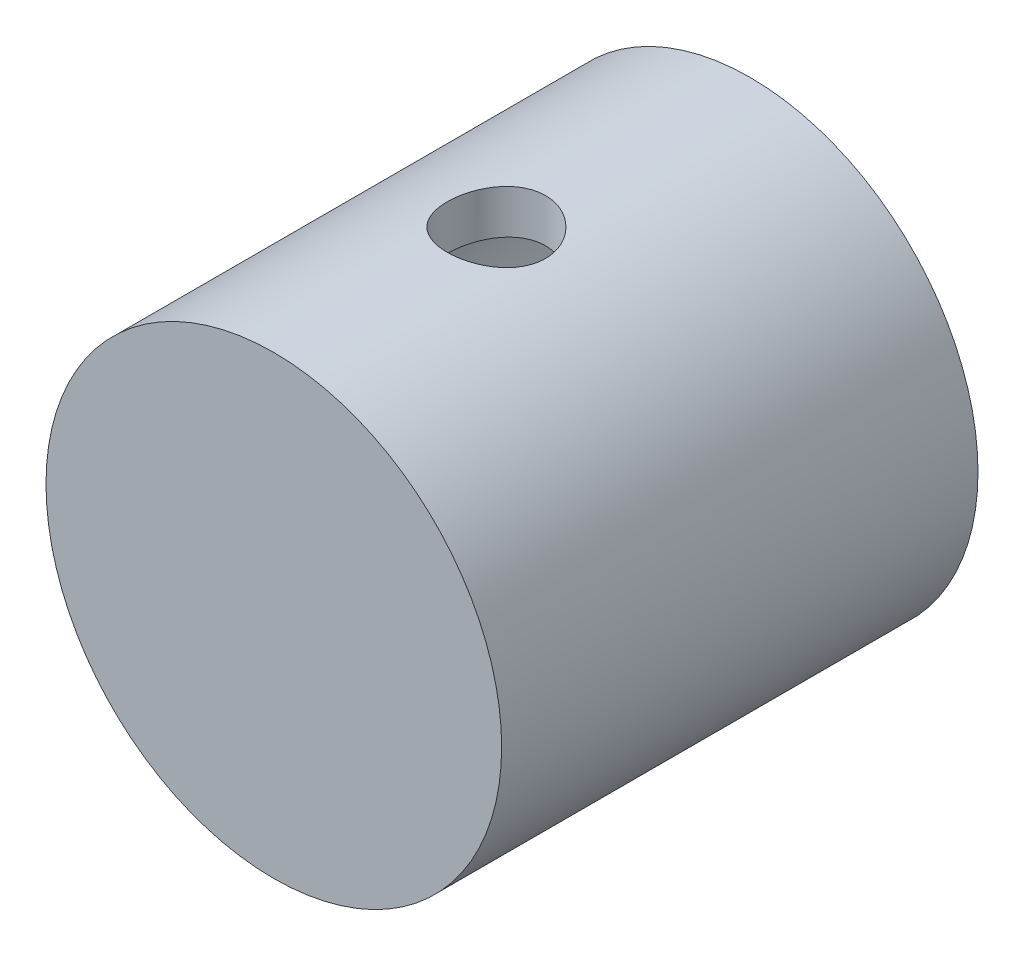
ISO-10303-21;
HEADER;
FILE_DESCRIPTION(('STEP AP214'),'2;1');
FILE_NAME('part.step','',(''),(''),'','','');
FILE_SCHEMA(('AUTOMOTIVE_DESIGN { 1 0 10303 214 1 1 1 1 }'));
ENDSEC;
DATA;
#1=APPLICATION_CONTEXT('core data for automotive mechanical design processes');
#2=APPLICATION_PROTOCOL_DEFINITION('international standard','automotive_design',2000,#1);
#3=PRODUCT_CONTEXT('',#1,'mechanical');
#4=PRODUCT('Part','Part','',(#3));
#5=PRODUCT_RELATED_PRODUCT_CATEGORY('part','',(#4));
#6=PRODUCT_DEFINITION_FORMATION('','',#4);
#7=PRODUCT_DEFINITION_CONTEXT('part definition',#1,'design');
#8=PRODUCT_DEFINITION('design','',#6,#7);
#9=PRODUCT_DEFINITION_SHAPE('','',#8);
#10=(LENGTH_UNIT() NAMED_UNIT(*) SI_UNIT(.MILLI.,.METRE.));
#11=(NAMED_UNIT(*) PLANE_ANGLE_UNIT() SI_UNIT($,.RADIAN.));
#12=(NAMED_UNIT(*) SI_UNIT($,.STERADIAN.) SOLID_ANGLE_UNIT());
#13=UNCERTAINTY_MEASURE_WITH_UNIT(LENGTH_MEASURE(1.E-05),#10,'distance_accuracy_value','');
#14=(GEOMETRIC_REPRESENTATION_CONTEXT(3) GLOBAL_UNCERTAINTY_ASSIGNED_CONTEXT((#13)) GLOBAL_UNIT_ASSIGNED_CONTEXT((#10,
#11,#12)) REPRESENTATION_CONTEXT('',''));
#15=CARTESIAN_POINT('',(0.,0.,0.));
#16=DIRECTION('',(0.,0.,1.));
#17=DIRECTION('',(1.,0.,0.));
#18=AXIS2_PLACEMENT_3D('',#15,#16,#17);
#19=CARTESIAN_POINT('',(0.,0.,46.));
#20=DIRECTION('',(0.,0.,-1.));
#21=DIRECTION('',(-1.,0.,0.));
#22=AXIS2_PLACEMENT_3D('',#19,#20,#21);
#23=CYLINDRICAL_SURFACE('',#22,22.);
#24=CARTESIAN_POINT('',(0.,-22.,29.2550355978762));
#25=CARTESIAN_POINT('',(0.26353204296739,-21.9999951294219,29.2550264823695));
#26=CARTESIAN_POINT('',(0.527175007044603,-21.995216638677,29.2330302389447));
#27=CARTESIAN_POINT('',(1.04697793452304,-21.9766157400084,29.1457144294558));
#28=CARTESIAN_POINT('',(1.30313231615062,-21.9627867570527,29.0803633663637));
#29=CARTESIAN_POINT('',(1.80037020267959,-21.927625318056,28.9084756851456));
#30=CARTESIAN_POINT('',(2.04146895126697,-21.9063006013467,28.801981535985));
#31=CARTESIAN_POINT('',(2.50236705126893,-21.8584518186079,28.5509641272918));
#32=CARTESIAN_POINT('',(2.72216706409193,-21.8319279141108,28.4064420491923));
#33=CARTESIAN_POINT('',(3.1376798099678,-21.7761241503772,28.0810757706023));
#34=CARTESIAN_POINT('',(3.33301125321571,-21.7468108407901,27.8997503336598));
#35=CARTESIAN_POINT('',(3.69073669867752,-21.6889689352535,27.5069578464537));
#36=CARTESIAN_POINT('',(3.85312782346228,-21.660440408045,27.2954881657509));
#37=CARTESIAN_POINT('',(4.14203598377663,-21.6070688778162,26.8456027662467));
#38=CARTESIAN_POINT('',(4.26814883514838,-21.5822687660423,26.6069219456019));
#39=CARTESIAN_POINT('',(4.47832844445401,-21.539641387516,26.111131882592));
#40=CARTESIAN_POINT('',(4.56240009176495,-21.5218133099712,25.8540247871743));
#41=CARTESIAN_POINT('',(4.68485414272049,-21.4954888932389,25.3328114244865));
#42=CARTESIAN_POINT('',(4.72391069221368,-21.486855015404,25.0688706353359));
#43=CARTESIAN_POINT('',(4.75732170448075,-21.479483346558,24.5380525051373));
#44=CARTESIAN_POINT('',(4.75168151640916,-21.4807443713582,24.2711755193006));
#45=CARTESIAN_POINT('',(4.69640206671622,-21.4928954361561,23.7470599127777));
#46=CARTESIAN_POINT('',(4.64754432524886,-21.5036144353184,23.4897342988595));
#47=CARTESIAN_POINT('',(4.50845411405232,-21.5332034385052,22.9870203788083));
#48=CARTESIAN_POINT('',(4.41821937643281,-21.5520738893108,22.7416327278155));
#49=CARTESIAN_POINT('',(4.19821456451248,-21.5960091025994,22.267554770304));
#50=CARTESIAN_POINT('',(4.06814254711242,-21.6211208867659,22.0390091251793));
#51=CARTESIAN_POINT('',(3.77236786380136,-21.6746802550419,21.6066985014783));
#52=CARTESIAN_POINT('',(3.60666045888965,-21.7031282825955,21.4029368244658));
#53=CARTESIAN_POINT('',(3.24017447299117,-21.7608897445783,21.0214771269695));
#54=CARTESIAN_POINT('',(3.03873094855511,-21.7902087890038,20.8444181824244));
#55=CARTESIAN_POINT('',(2.6086800808275,-21.8458628568335,20.5264941155677));
#56=CARTESIAN_POINT('',(2.38007226971292,-21.8721978288307,20.3856296167287));
#57=CARTESIAN_POINT('',(1.90141306408901,-21.9189985841214,20.1439413828342));
#58=CARTESIAN_POINT('',(1.65131897504386,-21.9394523135195,20.0431997211332));
#59=CARTESIAN_POINT('',(1.13721322725776,-21.9720961468981,19.8853469239985));
#60=CARTESIAN_POINT('',(0.87320354508278,-21.9842874210839,19.8282296099352));
#61=CARTESIAN_POINT('',(0.344244231815079,-21.9988667139343,19.760172526289));
#62=CARTESIAN_POINT('',(0.0794119141996826,-22.0014400901811,19.7483595269488));
#63=CARTESIAN_POINT('',(-0.448441985428533,-21.9970123463287,19.7688819111574));
#64=CARTESIAN_POINT('',(-0.711463685799219,-21.9900118581506,19.8012143808915));
#65=CARTESIAN_POINT('',(-1.22534871353153,-21.9673397922822,19.9083855746546));
#66=CARTESIAN_POINT('',(-1.47631171082119,-21.9517613770129,19.9827678355097));
#67=CARTESIAN_POINT('',(-1.96219970824823,-21.9136764897364,20.1714217427214));
#68=CARTESIAN_POINT('',(-2.19712336440687,-21.8911694380289,20.2856967269021));
#69=CARTESIAN_POINT('',(-2.64788611177591,-21.8412658325223,20.5527224667595));
#70=CARTESIAN_POINT('',(-2.86341290680292,-21.813805391972,20.7059882025687));
#71=CARTESIAN_POINT('',(-3.26600155810255,-21.75717438073,21.0459648953836));
#72=CARTESIAN_POINT('',(-3.45305981315513,-21.7280035943281,21.2326800771919));
#73=CARTESIAN_POINT('',(-3.79684116584989,-21.6706017739989,21.6382578217244));
#74=CARTESIAN_POINT('',(-3.95296036730982,-21.6423969597818,21.8576366580874));
#75=CARTESIAN_POINT('',(-4.2261415389516,-21.5907187278185,22.3200136114647));
#76=CARTESIAN_POINT('',(-4.34320518360488,-21.5672451072439,22.5630107152903));
#77=CARTESIAN_POINT('',(-4.53417217746252,-21.527907413176,23.064432268702));
#78=CARTESIAN_POINT('',(-4.60831576785363,-21.5120010735777,23.3227617435038));
#79=CARTESIAN_POINT('',(-4.71204604721923,-21.4895204764784,23.8485991315223));
#80=CARTESIAN_POINT('',(-4.74163965207832,-21.4829447705107,24.1161056135158));
#81=CARTESIAN_POINT('',(-4.75514145715969,-21.479959567652,24.6466187500412));
#82=CARTESIAN_POINT('',(-4.74000662243135,-21.48333711641,24.9096003051889));
#83=CARTESIAN_POINT('',(-4.66661628485676,-21.4993971553955,25.4291715641842));
#84=CARTESIAN_POINT('',(-4.60836126344546,-21.512079541735,25.6857613393627));
#85=CARTESIAN_POINT('',(-4.45084114787554,-21.545217774067,26.1845287850948));
#86=CARTESIAN_POINT('',(-4.35171192063186,-21.5656478486499,26.4267511903822));
#87=CARTESIAN_POINT('',(-4.1153753122238,-21.6119902740465,26.8912700741197));
#88=CARTESIAN_POINT('',(-3.97816408161354,-21.6379031790185,27.1135645351852));
#89=CARTESIAN_POINT('',(-3.66636960914247,-21.6929300863033,27.5366423778243));
#90=CARTESIAN_POINT('',(-3.49110292901713,-21.7220971250603,27.7369152852614));
#91=CARTESIAN_POINT('',(-3.10956192321569,-21.7799858535104,28.1055217900181));
#92=CARTESIAN_POINT('',(-2.90328044860301,-21.808707438838,28.2738480033074));
#93=CARTESIAN_POINT('',(-2.46244181668199,-21.8628969619462,28.5758045498498));
#94=CARTESIAN_POINT('',(-2.22756183078001,-21.8883194637862,28.7089721650104));
#95=CARTESIAN_POINT('',(-1.73825627645902,-21.9325920643142,28.9337282310939));
#96=CARTESIAN_POINT('',(-1.4838475079755,-21.9514477365752,29.025351962281));
#97=CARTESIAN_POINT('',(-1.02427764777811,-21.9770509267838,29.1478679139807));
#98=CARTESIAN_POINT('',(-0.821624223165775,-21.9856039881691,29.1879799139001));
#99=CARTESIAN_POINT('',(-0.412669769475188,-21.997080313052,29.2415667630072));
#100=CARTESIAN_POINT('',(-0.206368894674726,-22.0000038140933,29.255042736124));
#101=CARTESIAN_POINT('',(0.,-22.,29.2550355978762));
#102=B_SPLINE_CURVE_WITH_KNOTS('',3,(#24,#25,#26,#27,#28,#29,#30,#31,#32,#33,#34,#35,#36,#37,
#38,#39,#40,#41,#42,#43,#44,#45,#46,#47,#48,#49,#50,#51,#52,#53,#54,#55,#56,#57,#58,#59,#60,#61,
#62,#63,#64,#65,#66,#67,#68,#69,#70,#71,#72,#73,#74,#75,#76,#77,#78,#79,#80,#81,#82,#83,#84,#85,
#86,#87,#88,#89,#90,#91,#92,#93,#94,#95,#96,#97,#98,#99,#100,#101),.UNSPECIFIED.,.T.,.F.,(4,2,2,
2,2,2,2,2,2,2,2,2,2,2,2,2,2,2,2,2,2,2,2,2,2,2,2,2,2,2,2,2,2,2,2,2,2,2,4),(0.,0.78984080440211,
1.58025605292088,2.36985758476699,3.1594345885568,3.96009143600953,4.7608181929918,
5.57014811205846,6.37938388444031,7.17633628395209,7.97319330833398,8.755928483683,
9.53870656620086,10.3275709659652,11.1165403384432,11.9221209018524,12.727715340972,
13.5349493045839,14.3420689163397,15.1335509319106,15.9249807083636,16.7079798460244,
17.4910445129321,18.2850436133355,19.0791430698892,19.8874775227463,20.695777314545,
21.4995078461554,22.303113594762,23.0896515197956,23.8761806633008,24.6601161744422,
25.444130957072,26.2436021126139,27.0432578302562,27.8529651075726,28.6619834642787,
29.2805247628391,29.8990399609838),.UNSPECIFIED.);
#103=CARTESIAN_POINT('',(0.,-22.,29.2550355978762));
#104=VERTEX_POINT('',#103);
#105=EDGE_CURVE('E95',#104,#104,#102,.T.);
#106=ORIENTED_EDGE('',*,*,#105,.T.);
#107=EDGE_LOOP('',(#106));
#108=FACE_BOUND('',#107,.T.);
#109=CARTESIAN_POINT('',(0.,22.,29.2550355978762));
#110=CARTESIAN_POINT('',(-0.26353204296739,21.9999951294219,29.2550264823695));
#111=CARTESIAN_POINT('',(-0.527175007044603,21.995216638677,29.2330302389447));
#112=CARTESIAN_POINT('',(-1.04697793452304,21.9766157400084,29.1457144294558));
#113=CARTESIAN_POINT('',(-1.30313231615062,21.9627867570527,29.0803633663637));
#114=CARTESIAN_POINT('',(-1.80037020267959,21.927625318056,28.9084756851456));
#115=CARTESIAN_POINT('',(-2.04146895126697,21.9063006013467,28.801981535985));
#116=CARTESIAN_POINT('',(-2.50236705126893,21.8584518186079,28.5509641272918));
#117=CARTESIAN_POINT('',(-2.72216706409193,21.8319279141108,28.4064420491923));
#118=CARTESIAN_POINT('',(-3.1376798099678,21.7761241503772,28.0810757706023));
#119=CARTESIAN_POINT('',(-3.33301125321571,21.7468108407901,27.8997503336598));
#120=CARTESIAN_POINT('',(-3.69073669867752,21.6889689352535,27.5069578464537));
#121=CARTESIAN_POINT('',(-3.85312782346228,21.660440408045,27.2954881657509));
#122=CARTESIAN_POINT('',(-4.14203598377663,21.6070688778162,26.8456027662467));
#123=CARTESIAN_POINT('',(-4.26814883514838,21.5822687660423,26.6069219456019));
#124=CARTESIAN_POINT('',(-4.47832844445401,21.539641387516,26.111131882592));
#125=CARTESIAN_POINT('',(-4.56240009176495,21.5218133099712,25.8540247871743));
#126=CARTESIAN_POINT('',(-4.68485414272049,21.4954888932389,25.3328114244865));
#127=CARTESIAN_POINT('',(-4.72391069221368,21.486855015404,25.0688706353359));
#128=CARTESIAN_POINT('',(-4.75732170448075,21.479483346558,24.5380525051373));
#129=CARTESIAN_POINT('',(-4.75168151640916,21.4807443713582,24.2711755193006));
#130=CARTESIAN_POINT('',(-4.69640206671622,21.4928954361561,23.7470599127777));
#131=CARTESIAN_POINT('',(-4.64754432524886,21.5036144353184,23.4897342988595));
#132=CARTESIAN_POINT('',(-4.50845411405232,21.5332034385052,22.9870203788083));
#133=CARTESIAN_POINT('',(-4.41821937643281,21.5520738893108,22.7416327278155));
#134=CARTESIAN_POINT('',(-4.19821456451248,21.5960091025994,22.267554770304));
#135=CARTESIAN_POINT('',(-4.06814254711242,21.6211208867659,22.0390091251793));
#136=CARTESIAN_POINT('',(-3.77236786380136,21.6746802550419,21.6066985014783));
#137=CARTESIAN_POINT('',(-3.60666045888965,21.7031282825955,21.4029368244658));
#138=CARTESIAN_POINT('',(-3.24017447299117,21.7608897445783,21.0214771269695));
#139=CARTESIAN_POINT('',(-3.03873094855511,21.7902087890038,20.8444181824244));
#140=CARTESIAN_POINT('',(-2.6086800808275,21.8458628568335,20.5264941155677));
#141=CARTESIAN_POINT('',(-2.38007226971292,21.8721978288307,20.3856296167287));
#142=CARTESIAN_POINT('',(-1.90141306408901,21.9189985841214,20.1439413828342));
#143=CARTESIAN_POINT('',(-1.65131897504386,21.9394523135195,20.0431997211332));
#144=CARTESIAN_POINT('',(-1.13721322725776,21.9720961468981,19.8853469239985));
#145=CARTESIAN_POINT('',(-0.87320354508278,21.9842874210839,19.8282296099352));
#146=CARTESIAN_POINT('',(-0.344244231815079,21.9988667139343,19.760172526289));
#147=CARTESIAN_POINT('',(-0.0794119141996826,22.0014400901811,19.7483595269488));
#148=CARTESIAN_POINT('',(0.448441985428533,21.9970123463287,19.7688819111574));
#149=CARTESIAN_POINT('',(0.711463685799219,21.9900118581506,19.8012143808915));
#150=CARTESIAN_POINT('',(1.22534871353153,21.9673397922822,19.9083855746546));
#151=CARTESIAN_POINT('',(1.47631171082119,21.9517613770129,19.9827678355097));
#152=CARTESIAN_POINT('',(1.96219970824823,21.9136764897364,20.1714217427214));
#153=CARTESIAN_POINT('',(2.19712336440687,21.8911694380289,20.2856967269021));
#154=CARTESIAN_POINT('',(2.64788611177591,21.8412658325223,20.5527224667595));
#155=CARTESIAN_POINT('',(2.86341290680292,21.813805391972,20.7059882025687));
#156=CARTESIAN_POINT('',(3.26600155810255,21.75717438073,21.0459648953836));
#157=CARTESIAN_POINT('',(3.45305981315513,21.7280035943281,21.2326800771919));
#158=CARTESIAN_POINT('',(3.79684116584989,21.6706017739989,21.6382578217244));
#159=CARTESIAN_POINT('',(3.95296036730982,21.6423969597818,21.8576366580874));
#160=CARTESIAN_POINT('',(4.2261415389516,21.5907187278185,22.3200136114647));
#161=CARTESIAN_POINT('',(4.34320518360488,21.5672451072439,22.5630107152903));
#162=CARTESIAN_POINT('',(4.53417217746252,21.527907413176,23.064432268702));
#163=CARTESIAN_POINT('',(4.60831576785363,21.5120010735777,23.3227617435038));
#164=CARTESIAN_POINT('',(4.71204604721923,21.4895204764784,23.8485991315223));
#165=CARTESIAN_POINT('',(4.74163965207832,21.4829447705107,24.1161056135158));
#166=CARTESIAN_POINT('',(4.75514145715969,21.479959567652,24.6466187500412));
#167=CARTESIAN_POINT('',(4.74000662243135,21.48333711641,24.9096003051889));
#168=CARTESIAN_POINT('',(4.66661628485676,21.4993971553955,25.4291715641842));
#169=CARTESIAN_POINT('',(4.60836126344546,21.512079541735,25.6857613393627));
#170=CARTESIAN_POINT('',(4.45084114787554,21.545217774067,26.1845287850948));
#171=CARTESIAN_POINT('',(4.35171192063186,21.5656478486499,26.4267511903822));
#172=CARTESIAN_POINT('',(4.1153753122238,21.6119902740465,26.8912700741197));
#173=CARTESIAN_POINT('',(3.97816408161354,21.6379031790185,27.1135645351852));
#174=CARTESIAN_POINT('',(3.66636960914247,21.6929300863033,27.5366423778243));
#175=CARTESIAN_POINT('',(3.49110292901713,21.7220971250603,27.7369152852614));
#176=CARTESIAN_POINT('',(3.10956192321569,21.7799858535104,28.1055217900181));
#177=CARTESIAN_POINT('',(2.90328044860301,21.808707438838,28.2738480033074));
#178=CARTESIAN_POINT('',(2.46244181668199,21.8628969619462,28.5758045498498));
#179=CARTESIAN_POINT('',(2.22756183078001,21.8883194637862,28.7089721650104));
#180=CARTESIAN_POINT('',(1.73825627645902,21.9325920643142,28.9337282310939));
#181=CARTESIAN_POINT('',(1.4838475079755,21.9514477365752,29.025351962281));
#182=CARTESIAN_POINT('',(1.02427764777811,21.9770509267838,29.1478679139807));
#183=CARTESIAN_POINT('',(0.821624223165775,21.9856039881691,29.1879799139001));
#184=CARTESIAN_POINT('',(0.412669769475188,21.997080313052,29.2415667630072));
#185=CARTESIAN_POINT('',(0.206368894674726,22.0000038140933,29.255042736124));
#186=CARTESIAN_POINT('',(0.,22.,29.2550355978762));
#187=B_SPLINE_CURVE_WITH_KNOTS('',3,(#109,#110,#111,#112,#113,#114,#115,#116,#117,#118,#119,
#120,#121,#122,#123,#124,#125,#126,#127,#128,#129,#130,#131,#132,#133,#134,#135,#136,#137,#138,
#139,#140,#141,#142,#143,#144,#145,#146,#147,#148,#149,#150,#151,#152,#153,#154,#155,#156,#157,
#158,#159,#160,#161,#162,#163,#164,#165,#166,#167,#168,#169,#170,#171,#172,#173,#174,#175,#176,
#177,#178,#179,#180,#181,#182,#183,#184,#185,#186),.UNSPECIFIED.,.T.,.F.,(4,2,2,2,2,2,2,2,2,2,2,
2,2,2,2,2,2,2,2,2,2,2,2,2,2,2,2,2,2,2,2,2,2,2,2,2,2,2,4),(0.,0.78984080440211,1.58025605292088,
2.36985758476699,3.1594345885568,3.96009143600953,4.7608181929918,5.57014811205846,
6.37938388444031,7.17633628395209,7.97319330833398,8.755928483683,9.53870656620086,
10.3275709659652,11.1165403384432,11.9221209018524,12.727715340972,13.5349493045839,
14.3420689163397,15.1335509319106,15.9249807083636,16.7079798460244,17.4910445129321,
18.2850436133355,19.0791430698892,19.8874775227463,20.695777314545,21.4995078461554,
22.303113594762,23.0896515197956,23.8761806633008,24.6601161744422,25.444130957072,
26.2436021126139,27.0432578302562,27.8529651075726,28.6619834642787,29.2805247628391,
29.8990399609838),.UNSPECIFIED.);
#188=CARTESIAN_POINT('',(0.,22.,29.2550355978762));
#189=VERTEX_POINT('',#188);
#190=EDGE_CURVE('E89',#189,#189,#187,.T.);
#191=ORIENTED_EDGE('',*,*,#190,.T.);
#192=EDGE_LOOP('',(#191));
#193=FACE_BOUND('',#192,.T.);
#194=CARTESIAN_POINT('',(0.,0.,46.));
#195=DIRECTION('',(0.,0.,1.));
#196=DIRECTION('',(1.,0.,0.));
#197=AXIS2_PLACEMENT_3D('',#194,#195,#196);
#198=CIRCLE('',#197,22.);
#199=CARTESIAN_POINT('',(22.,0.,46.));
#200=VERTEX_POINT('',#199);
#201=EDGE_CURVE('E10',#200,#200,#198,.T.);
#202=ORIENTED_EDGE('',*,*,#201,.F.);
#203=EDGE_LOOP('',(#202));
#204=FACE_BOUND('',#203,.T.);
#205=CARTESIAN_POINT('',(0.,0.,0.));
#206=DIRECTION('',(0.,0.,1.));
#207=DIRECTION('',(1.,0.,0.));
#208=AXIS2_PLACEMENT_3D('',#205,#206,#207);
#209=CIRCLE('',#208,22.);
#210=CARTESIAN_POINT('',(22.,0.,0.));
#211=VERTEX_POINT('',#210);
#212=EDGE_CURVE('E57',#211,#211,#209,.T.);
#213=ORIENTED_EDGE('',*,*,#212,.T.);
#214=EDGE_LOOP('',(#213));
#215=FACE_BOUND('',#214,.T.);
#216=ADVANCED_FACE('F43',(#108,#193,#204,#215),#23,.T.);
#217=CARTESIAN_POINT('',(0.,0.,46.));
#218=DIRECTION('',(0.,0.,1.));
#219=DIRECTION('',(1.,0.,0.));
#220=AXIS2_PLACEMENT_3D('',#217,#218,#219);
#221=PLANE('',#220);
#222=ORIENTED_EDGE('',*,*,#201,.T.);
#223=EDGE_LOOP('',(#222));
#224=FACE_BOUND('',#223,.T.);
#225=ADVANCED_FACE('F121',(#224),#221,.T.);
#226=CARTESIAN_POINT('',(0.,0.,0.));
#227=DIRECTION('',(0.,0.,1.));
#228=DIRECTION('',(1.,0.,0.));
#229=AXIS2_PLACEMENT_3D('',#226,#227,#228);
#230=PLANE('',#229);
#231=CARTESIAN_POINT('',(0.,0.,0.));
#232=DIRECTION('',(0.,0.,1.));
#233=DIRECTION('',(1.,0.,0.));
#234=AXIS2_PLACEMENT_3D('',#231,#232,#233);
#235=CIRCLE('',#234,17.8);
#236=CARTESIAN_POINT('',(17.8,0.,0.));
#237=VERTEX_POINT('',#236);
#238=EDGE_CURVE('E66',#237,#237,#235,.T.);
#239=ORIENTED_EDGE('',*,*,#238,.T.);
#240=EDGE_LOOP('',(#239));
#241=FACE_BOUND('',#240,.T.);
#242=ORIENTED_EDGE('',*,*,#212,.F.);
#243=EDGE_LOOP('',(#242));
#244=FACE_BOUND('',#243,.T.);
#245=ADVANCED_FACE('F109',(#241,#244),#230,.F.);
#246=CARTESIAN_POINT('',(0.,0.,43.));
#247=DIRECTION('',(0.,0.,-1.));
#248=DIRECTION('',(-1.,0.,0.));
#249=AXIS2_PLACEMENT_3D('',#246,#247,#248);
#250=CYLINDRICAL_SURFACE('',#249,17.8);
#251=CARTESIAN_POINT('',(0.,-17.8,29.2550355978762));
#252=CARTESIAN_POINT('',(0.261847787560677,-17.7999960597316,29.25502939686));
#253=CARTESIAN_POINT('',(0.523762008270908,-17.7941652621681,29.2333111429483));
#254=CARTESIAN_POINT('',(1.04004502762271,-17.7714713505597,29.147165999833));
#255=CARTESIAN_POINT('',(1.29441014123805,-17.7546029382752,29.0827185997283));
#256=CARTESIAN_POINT('',(1.78806800426624,-17.7116955502808,28.9133599734013));
#257=CARTESIAN_POINT('',(2.02737974022271,-17.6856684112467,28.8085009583015));
#258=CARTESIAN_POINT('',(2.48502016770426,-17.6271939349945,28.5614893204804));
#259=CARTESIAN_POINT('',(2.70334745177713,-17.5947461675829,28.4193341986465));
#260=CARTESIAN_POINT('',(3.11789014931757,-17.5260911490344,28.0982813348682));
#261=CARTESIAN_POINT('',(3.31354898256825,-17.4898195694336,27.9186786797176));
#262=CARTESIAN_POINT('',(3.67235720471966,-17.4180178710864,27.5293358790674));
#263=CARTESIAN_POINT('',(3.83550240222189,-17.3824878484635,27.3195918539734));
#264=CARTESIAN_POINT('',(4.12736725255766,-17.3155339383902,26.8714760523825));
#265=CARTESIAN_POINT('',(4.25544639091558,-17.2841912049985,26.6326738595876));
#266=CARTESIAN_POINT('',(4.46941777618805,-17.2301064896231,26.1359536119747));
#267=CARTESIAN_POINT('',(4.55531781411667,-17.2073629194436,25.8780390975818));
#268=CARTESIAN_POINT('',(4.68055923196043,-17.1737158228824,25.3565799117746));
#269=CARTESIAN_POINT('',(4.72090980972152,-17.1625561135604,25.093294557347));
#270=CARTESIAN_POINT('',(4.7570532388716,-17.1525748994252,24.5634732130676));
#271=CARTESIAN_POINT('',(4.75285442855675,-17.1537510857055,24.2969378408489));
#272=CARTESIAN_POINT('',(4.70081942818828,-17.1680794908641,23.7760613513519));
#273=CARTESIAN_POINT('',(4.65420464555654,-17.1808964827862,23.5215875282771));
#274=CARTESIAN_POINT('',(4.52061725665225,-17.2165255580491,23.0242103334162));
#275=CARTESIAN_POINT('',(4.43364142083614,-17.2393384412162,22.7813078892448));
#276=CARTESIAN_POINT('',(4.22080606663462,-17.2926834912073,22.3107858468418));
#277=CARTESIAN_POINT('',(4.09451852104052,-17.3232999236976,22.083369818946));
#278=CARTESIAN_POINT('',(3.80694319252477,-17.3887570995527,21.6525281904261));
#279=CARTESIAN_POINT('',(3.64564851120193,-17.4235986749137,21.4491073304298));
#280=CARTESIAN_POINT('',(3.28639330046539,-17.4949755538662,21.0650523198913));
#281=CARTESIAN_POINT('',(3.08740716940848,-17.5315290067509,20.8853795663623));
#282=CARTESIAN_POINT('',(2.66168176335874,-17.6011904502963,20.5617572489268));
#283=CARTESIAN_POINT('',(2.43494139207929,-17.6342983047608,20.4178090968149));
#284=CARTESIAN_POINT('',(1.95865361142792,-17.6935423222627,20.1692980053299));
#285=CARTESIAN_POINT('',(1.70901120968723,-17.7196475067829,20.0649092564176));
#286=CARTESIAN_POINT('',(1.19486473778482,-17.7617209073371,19.8998590423491));
#287=CARTESIAN_POINT('',(0.930363933518463,-17.7776913415855,19.8391880082093));
#288=CARTESIAN_POINT('',(0.402213450137756,-17.7973602684916,19.7648054632542));
#289=CARTESIAN_POINT('',(0.138760293856482,-17.8014002439822,19.7497868735172));
#290=CARTESIAN_POINT('',(-0.386900493142442,-17.7977349483992,19.763525588622));
#291=CARTESIAN_POINT('',(-0.649108249972549,-17.7900308931396,19.792278361984));
#292=CARTESIAN_POINT('',(-1.16016854114614,-17.7639637480094,19.8916716106819));
#293=CARTESIAN_POINT('',(-1.40917323945035,-17.7457863374256,19.9615828572829));
#294=CARTESIAN_POINT('',(-1.89189608423781,-17.7008346770193,20.140461546597));
#295=CARTESIAN_POINT('',(-2.12561256976351,-17.67405949497,20.2494332246475));
#296=CARTESIAN_POINT('',(-2.57620198541671,-17.6140824420301,20.5057627189194));
#297=CARTESIAN_POINT('',(-2.79265475717808,-17.5807648443417,20.6538313558966));
#298=CARTESIAN_POINT('',(-3.19809989021111,-17.5115542410772,20.9832581658652));
#299=CARTESIAN_POINT('',(-3.38708680621115,-17.4756607269115,21.164622923927));
#300=CARTESIAN_POINT('',(-3.737744664797,-17.4040870468657,21.5615935668018));
#301=CARTESIAN_POINT('',(-3.89849336998998,-17.3684415378741,21.7780218574162));
#302=CARTESIAN_POINT('',(-4.18141060113481,-17.3025139125298,22.2355353717199));
#303=CARTESIAN_POINT('',(-4.30358073481132,-17.2722315726953,22.4766195673438));
#304=CARTESIAN_POINT('',(-4.50495359949454,-17.220807180214,22.9754008123239));
#305=CARTESIAN_POINT('',(-4.58440486028165,-17.1996124073767,23.2329917933947));
#306=CARTESIAN_POINT('',(-4.69867099241197,-17.168752445761,23.7585396495881));
#307=CARTESIAN_POINT('',(-4.7334972902273,-17.1590843055677,24.0264938530391));
#308=CARTESIAN_POINT('',(-4.75686700218613,-17.1526190476674,24.5557192821753));
#309=CARTESIAN_POINT('',(-4.74689281413152,-17.1554096648664,24.8169209907933));
#310=CARTESIAN_POINT('',(-4.68438386076795,-17.1725821243807,25.3337729653885));
#311=CARTESIAN_POINT('',(-4.63185019359678,-17.186963667622,25.5894233744279));
#312=CARTESIAN_POINT('',(-4.48657349284628,-17.2254519818641,26.0860470704578));
#313=CARTESIAN_POINT('',(-4.39414499108239,-17.2494825782316,26.3271186858613));
#314=CARTESIAN_POINT('',(-4.17194666751671,-17.3045631145372,26.7905154984009));
#315=CARTESIAN_POINT('',(-4.04217098076547,-17.335614156792,27.0128377440663));
#316=CARTESIAN_POINT('',(-3.74447109176062,-17.4023797555341,27.4394997231725));
#317=CARTESIAN_POINT('',(-3.57553550655274,-17.4382047649766,27.6431165782482));
#318=CARTESIAN_POINT('',(-3.20623420280816,-17.509865275847,28.0195931629489));
#319=CARTESIAN_POINT('',(-3.00586085029229,-17.5457007777077,28.1924454002377));
#320=CARTESIAN_POINT('',(-2.57419026118057,-17.6142629365477,28.5061276821698));
#321=CARTESIAN_POINT('',(-2.34232231682346,-17.646906507603,28.6461920578747));
#322=CARTESIAN_POINT('',(-1.85746805329111,-17.7044974408443,28.8851326228552));
#323=CARTESIAN_POINT('',(-1.6044953903198,-17.7294497314852,28.9840352022714));
#324=CARTESIAN_POINT('',(-1.12705786415662,-17.7656256355805,29.1249666028628));
#325=CARTESIAN_POINT('',(-0.904647756325138,-17.7784220164264,29.1736290811211));
#326=CARTESIAN_POINT('',(-0.454841476118618,-17.7956104936885,29.2386646725753));
#327=CARTESIAN_POINT('',(-0.227445799894642,-17.8000034225896,29.2550409841928));
#328=CARTESIAN_POINT('',(0.,-17.8,29.2550355978762));
#329=B_SPLINE_CURVE_WITH_KNOTS('',3,(#251,#252,#253,#254,#255,#256,#257,#258,#259,#260,#261,
#262,#263,#264,#265,#266,#267,#268,#269,#270,#271,#272,#273,#274,#275,#276,#277,#278,#279,#280,
#281,#282,#283,#284,#285,#286,#287,#288,#289,#290,#291,#292,#293,#294,#295,#296,#297,#298,#299,
#300,#301,#302,#303,#304,#305,#306,#307,#308,#309,#310,#311,#312,#313,#314,#315,#316,#317,#318,
#319,#320,#321,#322,#323,#324,#325,#326,#327,#328),.UNSPECIFIED.,.T.,.F.,(4,2,2,2,2,2,2,2,2,2,2,
2,2,2,2,2,2,2,2,2,2,2,2,2,2,2,2,2,2,2,2,2,2,2,2,2,2,2,4),(0.,0.78470925270876,1.56979545556909,
2.35387072246536,3.13799854158045,3.93849139763197,4.73908738017989,5.55345621771808,
6.36767457437828,7.16347544550792,7.95912736944519,8.73256870519634,9.5060719395629,
10.2883104710466,11.0707032882911,11.8786533711328,12.6866353781371,13.498134908829,
14.3094567635729,15.0973198075247,15.8851012926116,16.659328268653,17.4336392198231,
18.2231338157106,19.0127847207673,19.8247378136586,20.6366570647228,21.4438001697892,
22.2507365600087,23.0311726664096,23.8115886363074,24.5859610637487,25.3604551639685,
26.1577698955812,26.9552785382737,27.7698788397006,28.5839560673295,29.2656364776687,
29.9472493541026),.UNSPECIFIED.);
#330=CARTESIAN_POINT('',(0.,-17.8,29.2550355978762));
#331=VERTEX_POINT('',#330);
#332=EDGE_CURVE('E47',#331,#331,#329,.T.);
#333=ORIENTED_EDGE('',*,*,#332,.F.);
#334=EDGE_LOOP('',(#333));
#335=FACE_BOUND('',#334,.T.);
#336=CARTESIAN_POINT('',(0.,17.8,29.2550355978762));
#337=CARTESIAN_POINT('',(-0.261847787560677,17.7999960597316,29.25502939686));
#338=CARTESIAN_POINT('',(-0.523762008270908,17.7941652621681,29.2333111429483));
#339=CARTESIAN_POINT('',(-1.04004502762271,17.7714713505597,29.147165999833));
#340=CARTESIAN_POINT('',(-1.29441014123805,17.7546029382752,29.0827185997283));
#341=CARTESIAN_POINT('',(-1.78806800426624,17.7116955502808,28.9133599734013));
#342=CARTESIAN_POINT('',(-2.02737974022271,17.6856684112467,28.8085009583015));
#343=CARTESIAN_POINT('',(-2.48502016770426,17.6271939349945,28.5614893204804));
#344=CARTESIAN_POINT('',(-2.70334745177713,17.5947461675829,28.4193341986465));
#345=CARTESIAN_POINT('',(-3.11789014931757,17.5260911490344,28.0982813348682));
#346=CARTESIAN_POINT('',(-3.31354898256825,17.4898195694336,27.9186786797176));
#347=CARTESIAN_POINT('',(-3.67235720471966,17.4180178710864,27.5293358790674));
#348=CARTESIAN_POINT('',(-3.83550240222189,17.3824878484635,27.3195918539734));
#349=CARTESIAN_POINT('',(-4.12736725255766,17.3155339383902,26.8714760523825));
#350=CARTESIAN_POINT('',(-4.25544639091558,17.2841912049985,26.6326738595876));
#351=CARTESIAN_POINT('',(-4.46941777618805,17.2301064896231,26.1359536119747));
#352=CARTESIAN_POINT('',(-4.55531781411667,17.2073629194436,25.8780390975818));
#353=CARTESIAN_POINT('',(-4.68055923196043,17.1737158228824,25.3565799117746));
#354=CARTESIAN_POINT('',(-4.72090980972152,17.1625561135604,25.093294557347));
#355=CARTESIAN_POINT('',(-4.7570532388716,17.1525748994252,24.5634732130676));
#356=CARTESIAN_POINT('',(-4.75285442855675,17.1537510857055,24.2969378408489));
#357=CARTESIAN_POINT('',(-4.70081942818828,17.1680794908641,23.7760613513519));
#358=CARTESIAN_POINT('',(-4.65420464555654,17.1808964827862,23.5215875282771));
#359=CARTESIAN_POINT('',(-4.52061725665225,17.2165255580491,23.0242103334162));
#360=CARTESIAN_POINT('',(-4.43364142083614,17.2393384412162,22.7813078892448));
#361=CARTESIAN_POINT('',(-4.22080606663462,17.2926834912073,22.3107858468418));
#362=CARTESIAN_POINT('',(-4.09451852104052,17.3232999236976,22.083369818946));
#363=CARTESIAN_POINT('',(-3.80694319252477,17.3887570995527,21.6525281904261));
#364=CARTESIAN_POINT('',(-3.64564851120193,17.4235986749137,21.4491073304298));
#365=CARTESIAN_POINT('',(-3.28639330046539,17.4949755538662,21.0650523198913));
#366=CARTESIAN_POINT('',(-3.08740716940848,17.5315290067509,20.8853795663623));
#367=CARTESIAN_POINT('',(-2.66168176335874,17.6011904502963,20.5617572489268));
#368=CARTESIAN_POINT('',(-2.43494139207929,17.6342983047608,20.4178090968149));
#369=CARTESIAN_POINT('',(-1.95865361142792,17.6935423222627,20.1692980053299));
#370=CARTESIAN_POINT('',(-1.70901120968723,17.7196475067829,20.0649092564176));
#371=CARTESIAN_POINT('',(-1.19486473778482,17.7617209073371,19.8998590423491));
#372=CARTESIAN_POINT('',(-0.930363933518463,17.7776913415855,19.8391880082093));
#373=CARTESIAN_POINT('',(-0.402213450137756,17.7973602684916,19.7648054632542));
#374=CARTESIAN_POINT('',(-0.138760293856482,17.8014002439822,19.7497868735172));
#375=CARTESIAN_POINT('',(0.386900493142442,17.7977349483992,19.763525588622));
#376=CARTESIAN_POINT('',(0.649108249972549,17.7900308931396,19.792278361984));
#377=CARTESIAN_POINT('',(1.16016854114614,17.7639637480094,19.8916716106819));
#378=CARTESIAN_POINT('',(1.40917323945035,17.7457863374256,19.9615828572829));
#379=CARTESIAN_POINT('',(1.89189608423781,17.7008346770193,20.140461546597));
#380=CARTESIAN_POINT('',(2.12561256976351,17.67405949497,20.2494332246475));
#381=CARTESIAN_POINT('',(2.57620198541671,17.6140824420301,20.5057627189194));
#382=CARTESIAN_POINT('',(2.79265475717808,17.5807648443417,20.6538313558966));
#383=CARTESIAN_POINT('',(3.19809989021111,17.5115542410772,20.9832581658652));
#384=CARTESIAN_POINT('',(3.38708680621115,17.4756607269115,21.164622923927));
#385=CARTESIAN_POINT('',(3.737744664797,17.4040870468657,21.5615935668018));
#386=CARTESIAN_POINT('',(3.89849336998998,17.3684415378741,21.7780218574162));
#387=CARTESIAN_POINT('',(4.18141060113481,17.3025139125298,22.2355353717199));
#388=CARTESIAN_POINT('',(4.30358073481132,17.2722315726953,22.4766195673438));
#389=CARTESIAN_POINT('',(4.50495359949454,17.220807180214,22.9754008123239));
#390=CARTESIAN_POINT('',(4.58440486028165,17.1996124073767,23.2329917933947));
#391=CARTESIAN_POINT('',(4.69867099241197,17.168752445761,23.7585396495881));
#392=CARTESIAN_POINT('',(4.7334972902273,17.1590843055677,24.0264938530391));
#393=CARTESIAN_POINT('',(4.75686700218613,17.1526190476674,24.5557192821753));
#394=CARTESIAN_POINT('',(4.74689281413152,17.1554096648664,24.8169209907933));
#395=CARTESIAN_POINT('',(4.68438386076795,17.1725821243807,25.3337729653885));
#396=CARTESIAN_POINT('',(4.63185019359678,17.186963667622,25.5894233744279));
#397=CARTESIAN_POINT('',(4.48657349284628,17.2254519818641,26.0860470704578));
#398=CARTESIAN_POINT('',(4.39414499108239,17.2494825782316,26.3271186858613));
#399=CARTESIAN_POINT('',(4.17194666751671,17.3045631145372,26.7905154984009));
#400=CARTESIAN_POINT('',(4.04217098076547,17.335614156792,27.0128377440663));
#401=CARTESIAN_POINT('',(3.74447109176062,17.4023797555341,27.4394997231725));
#402=CARTESIAN_POINT('',(3.57553550655274,17.4382047649766,27.6431165782482));
#403=CARTESIAN_POINT('',(3.20623420280816,17.509865275847,28.0195931629489));
#404=CARTESIAN_POINT('',(3.00586085029229,17.5457007777077,28.1924454002377));
#405=CARTESIAN_POINT('',(2.57419026118057,17.6142629365477,28.5061276821698));
#406=CARTESIAN_POINT('',(2.34232231682346,17.646906507603,28.6461920578747));
#407=CARTESIAN_POINT('',(1.85746805329111,17.7044974408443,28.8851326228552));
#408=CARTESIAN_POINT('',(1.6044953903198,17.7294497314852,28.9840352022714));
#409=CARTESIAN_POINT('',(1.12705786415662,17.7656256355805,29.1249666028628));
#410=CARTESIAN_POINT('',(0.904647756325138,17.7784220164264,29.1736290811211));
#411=CARTESIAN_POINT('',(0.454841476118618,17.7956104936885,29.2386646725753));
#412=CARTESIAN_POINT('',(0.227445799894642,17.8000034225896,29.2550409841928));
#413=CARTESIAN_POINT('',(0.,17.8,29.2550355978762));
#414=B_SPLINE_CURVE_WITH_KNOTS('',3,(#336,#337,#338,#339,#340,#341,#342,#343,#344,#345,#346,
#347,#348,#349,#350,#351,#352,#353,#354,#355,#356,#357,#358,#359,#360,#361,#362,#363,#364,#365,
#366,#367,#368,#369,#370,#371,#372,#373,#374,#375,#376,#377,#378,#379,#380,#381,#382,#383,#384,
#385,#386,#387,#388,#389,#390,#391,#392,#393,#394,#395,#396,#397,#398,#399,#400,#401,#402,#403,
#404,#405,#406,#407,#408,#409,#410,#411,#412,#413),.UNSPECIFIED.,.T.,.F.,(4,2,2,2,2,2,2,2,2,2,2,
2,2,2,2,2,2,2,2,2,2,2,2,2,2,2,2,2,2,2,2,2,2,2,2,2,2,2,4),(0.,0.78470925270876,1.56979545556909,
2.35387072246536,3.13799854158045,3.93849139763197,4.73908738017989,5.55345621771808,
6.36767457437828,7.16347544550792,7.95912736944519,8.73256870519634,9.5060719395629,
10.2883104710466,11.0707032882911,11.8786533711328,12.6866353781371,13.498134908829,
14.3094567635729,15.0973198075247,15.8851012926116,16.659328268653,17.4336392198231,
18.2231338157106,19.0127847207673,19.8247378136586,20.6366570647228,21.4438001697892,
22.2507365600087,23.0311726664096,23.8115886363074,24.5859610637487,25.3604551639685,
26.1577698955812,26.9552785382737,27.7698788397006,28.5839560673295,29.2656364776687,
29.9472493541026),.UNSPECIFIED.);
#415=CARTESIAN_POINT('',(0.,17.8,29.2550355978762));
#416=VERTEX_POINT('',#415);
#417=EDGE_CURVE('E68',#416,#416,#414,.T.);
#418=ORIENTED_EDGE('',*,*,#417,.F.);
#419=EDGE_LOOP('',(#418));
#420=FACE_BOUND('',#419,.T.);
#421=CARTESIAN_POINT('',(0.,0.,43.));
#422=DIRECTION('',(0.,0.,1.));
#423=DIRECTION('',(1.,0.,0.));
#424=AXIS2_PLACEMENT_3D('',#421,#422,#423);
#425=CIRCLE('',#424,17.8);
#426=CARTESIAN_POINT('',(17.8,0.,43.));
#427=VERTEX_POINT('',#426);
#428=EDGE_CURVE('E63',#427,#427,#425,.T.);
#429=ORIENTED_EDGE('',*,*,#428,.T.);
#430=EDGE_LOOP('',(#429));
#431=FACE_BOUND('',#430,.T.);
#432=ORIENTED_EDGE('',*,*,#238,.F.);
#433=EDGE_LOOP('',(#432));
#434=FACE_BOUND('',#433,.T.);
#435=ADVANCED_FACE('F74',(#335,#420,#431,#434),#250,.F.);
#436=CARTESIAN_POINT('',(0.,0.,43.));
#437=DIRECTION('',(0.,0.,1.));
#438=DIRECTION('',(1.,0.,0.));
#439=AXIS2_PLACEMENT_3D('',#436,#437,#438);
#440=PLANE('',#439);
#441=ORIENTED_EDGE('',*,*,#428,.F.);
#442=EDGE_LOOP('',(#441));
#443=FACE_BOUND('',#442,.T.);
#444=ADVANCED_FACE('F83',(#443),#440,.F.);
#445=CARTESIAN_POINT('',(0.,-22.,24.5050355978762));
#446=DIRECTION('',(0.,1.,0.));
#447=DIRECTION('',(0.,0.,1.));
#448=AXIS2_PLACEMENT_3D('',#445,#446,#447);
#449=CYLINDRICAL_SURFACE('',#448,4.75);
#450=ORIENTED_EDGE('',*,*,#417,.T.);
#451=EDGE_LOOP('',(#450));
#452=FACE_BOUND('',#451,.T.);
#453=ORIENTED_EDGE('',*,*,#190,.F.);
#454=EDGE_LOOP('',(#453));
#455=FACE_BOUND('',#454,.T.);
#456=ADVANCED_FACE('F81',(#452,#455),#449,.F.);
#457=ORIENTED_EDGE('',*,*,#332,.T.);
#458=EDGE_LOOP('',(#457));
#459=FACE_BOUND('',#458,.T.);
#460=ORIENTED_EDGE('',*,*,#105,.F.);
#461=EDGE_LOOP('',(#460));
#462=FACE_BOUND('',#461,.T.);
#463=ADVANCED_FACE('F78',(#459,#462),#449,.F.);
#464=CLOSED_SHELL('',(#216,#225,#245,#435,#444,#456,#463));
#465=MANIFOLD_SOLID_BREP('B2',#464);
#466=ADVANCED_BREP_SHAPE_REPRESENTATION('',(#18,#465),#14);
#467=SHAPE_DEFINITION_REPRESENTATION(#9,#466);
ENDSEC;
END-ISO-10303-21;
